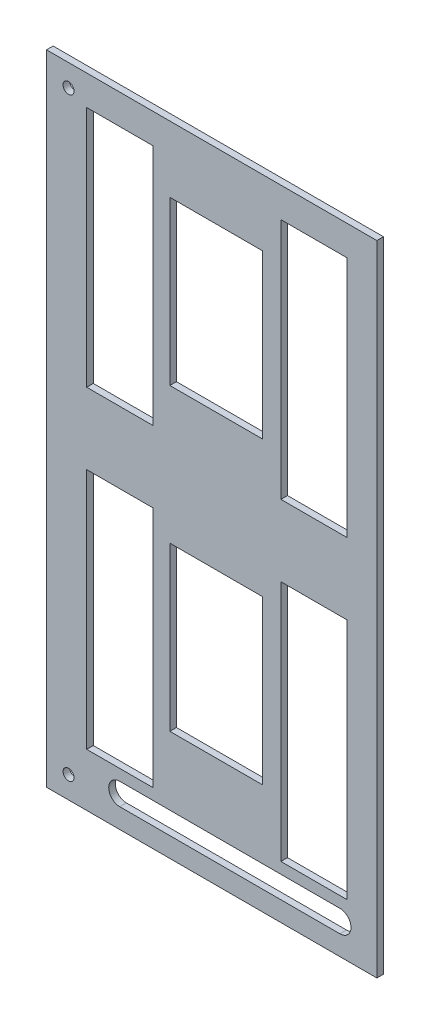
ISO-10303-21;
HEADER;
FILE_DESCRIPTION(('STEP AP214'),'2;1');
FILE_NAME('part.step','',(''),(''),'','','');
FILE_SCHEMA(('AUTOMOTIVE_DESIGN { 1 0 10303 214 1 1 1 1 }'));
ENDSEC;
DATA;
#1=APPLICATION_CONTEXT('core data for automotive mechanical design processes');
#2=APPLICATION_PROTOCOL_DEFINITION('international standard','automotive_design',2000,#1);
#3=PRODUCT_CONTEXT('',#1,'mechanical');
#4=PRODUCT('Part','Part','',(#3));
#5=PRODUCT_RELATED_PRODUCT_CATEGORY('part','',(#4));
#6=PRODUCT_DEFINITION_FORMATION('','',#4);
#7=PRODUCT_DEFINITION_CONTEXT('part definition',#1,'design');
#8=PRODUCT_DEFINITION('design','',#6,#7);
#9=PRODUCT_DEFINITION_SHAPE('','',#8);
#10=(LENGTH_UNIT() NAMED_UNIT(*) SI_UNIT(.MILLI.,.METRE.));
#11=(NAMED_UNIT(*) PLANE_ANGLE_UNIT() SI_UNIT($,.RADIAN.));
#12=(NAMED_UNIT(*) SI_UNIT($,.STERADIAN.) SOLID_ANGLE_UNIT());
#13=UNCERTAINTY_MEASURE_WITH_UNIT(LENGTH_MEASURE(1.E-05),#10,'distance_accuracy_value','');
#14=(GEOMETRIC_REPRESENTATION_CONTEXT(3) GLOBAL_UNCERTAINTY_ASSIGNED_CONTEXT((#13)) GLOBAL_UNIT_ASSIGNED_CONTEXT((#10,
#11,#12)) REPRESENTATION_CONTEXT('',''));
#15=CARTESIAN_POINT('',(0.,0.,0.));
#16=DIRECTION('',(0.,0.,1.));
#17=DIRECTION('',(1.,0.,0.));
#18=AXIS2_PLACEMENT_3D('',#15,#16,#17);
#19=CARTESIAN_POINT('',(-28.174258775512,51.6961515646284,3.));
#20=DIRECTION('',(1.,0.,0.));
#21=DIRECTION('',(0.,1.,0.));
#22=AXIS2_PLACEMENT_3D('',#19,#20,#21);
#23=PLANE('',#22);
#24=DIRECTION('',(0.,-1.,0.));
#25=VECTOR('',#24,1.);
#26=CARTESIAN_POINT('',(-28.174258775512,51.6961515646284,0.));
#27=LINE('',#26,#25);
#28=CARTESIAN_POINT('',(-28.174258775512,51.6961515646284,0.));
#29=VERTEX_POINT('',#28);
#30=CARTESIAN_POINT('',(-28.1742587755119,-238.303848435372,0.));
#31=VERTEX_POINT('',#30);
#32=EDGE_CURVE('E452',#29,#31,#27,.T.);
#33=ORIENTED_EDGE('',*,*,#32,.T.);
#34=DIRECTION('',(0.,0.,-1.));
#35=VECTOR('',#34,1.);
#36=CARTESIAN_POINT('',(-28.1742587755119,-238.303848435372,3.));
#37=LINE('',#36,#35);
#38=CARTESIAN_POINT('',(-28.1742587755119,-238.303848435372,3.));
#39=VERTEX_POINT('',#38);
#40=EDGE_CURVE('E11',#39,#31,#37,.T.);
#41=ORIENTED_EDGE('',*,*,#40,.F.);
#42=DIRECTION('',(0.,-1.,0.));
#43=VECTOR('',#42,1.);
#44=CARTESIAN_POINT('',(-28.174258775512,51.6961515646284,3.));
#45=LINE('',#44,#43);
#46=CARTESIAN_POINT('',(-28.174258775512,51.6961515646284,3.));
#47=VERTEX_POINT('',#46);
#48=EDGE_CURVE('E488',#47,#39,#45,.T.);
#49=ORIENTED_EDGE('',*,*,#48,.F.);
#50=DIRECTION('',(0.,0.,-1.));
#51=VECTOR('',#50,1.);
#52=CARTESIAN_POINT('',(-28.174258775512,51.6961515646284,3.));
#53=LINE('',#52,#51);
#54=EDGE_CURVE('E498',#47,#29,#53,.T.);
#55=ORIENTED_EDGE('',*,*,#54,.T.);
#56=EDGE_LOOP('',(#33,#41,#49,#55));
#57=FACE_BOUND('',#56,.T.);
#58=ADVANCED_FACE('F41',(#57),#23,.F.);
#59=CARTESIAN_POINT('',(-28.1742587755119,-238.303848435372,3.));
#60=DIRECTION('',(0.,1.,0.));
#61=DIRECTION('',(0.,0.,1.));
#62=AXIS2_PLACEMENT_3D('',#59,#60,#61);
#63=PLANE('',#62);
#64=DIRECTION('',(1.,0.,0.));
#65=VECTOR('',#64,1.);
#66=CARTESIAN_POINT('',(-28.1742587755119,-238.303848435372,0.));
#67=LINE('',#66,#65);
#68=CARTESIAN_POINT('',(121.825741224488,-238.303848435372,0.));
#69=VERTEX_POINT('',#68);
#70=EDGE_CURVE('E501',#31,#69,#67,.T.);
#71=ORIENTED_EDGE('',*,*,#70,.T.);
#72=DIRECTION('',(0.,0.,-1.));
#73=VECTOR('',#72,1.);
#74=CARTESIAN_POINT('',(121.825741224488,-238.303848435372,3.));
#75=LINE('',#74,#73);
#76=CARTESIAN_POINT('',(121.825741224488,-238.303848435372,3.));
#77=VERTEX_POINT('',#76);
#78=EDGE_CURVE('E48',#77,#69,#75,.T.);
#79=ORIENTED_EDGE('',*,*,#78,.F.);
#80=DIRECTION('',(1.,0.,0.));
#81=VECTOR('',#80,1.);
#82=CARTESIAN_POINT('',(-28.1742587755119,-238.303848435372,3.));
#83=LINE('',#82,#81);
#84=EDGE_CURVE('E491',#39,#77,#83,.T.);
#85=ORIENTED_EDGE('',*,*,#84,.F.);
#86=ORIENTED_EDGE('',*,*,#40,.T.);
#87=EDGE_LOOP('',(#71,#79,#85,#86));
#88=FACE_BOUND('',#87,.T.);
#89=ADVANCED_FACE('F530',(#88),#63,.F.);
#90=CARTESIAN_POINT('',(121.825741224488,51.6961515646284,3.));
#91=DIRECTION('',(-1.,0.,0.));
#92=DIRECTION('',(0.,-1.,0.));
#93=AXIS2_PLACEMENT_3D('',#90,#91,#92);
#94=PLANE('',#93);
#95=DIRECTION('',(0.,1.,0.));
#96=VECTOR('',#95,1.);
#97=CARTESIAN_POINT('',(121.825741224488,51.6961515646284,0.));
#98=LINE('',#97,#96);
#99=CARTESIAN_POINT('',(121.825741224488,51.6961515646284,0.));
#100=VERTEX_POINT('',#99);
#101=EDGE_CURVE('E503',#69,#100,#98,.T.);
#102=ORIENTED_EDGE('',*,*,#101,.T.);
#103=DIRECTION('',(0.,0.,-1.));
#104=VECTOR('',#103,1.);
#105=CARTESIAN_POINT('',(121.825741224488,51.6961515646284,3.));
#106=LINE('',#105,#104);
#107=CARTESIAN_POINT('',(121.825741224488,51.6961515646284,3.));
#108=VERTEX_POINT('',#107);
#109=EDGE_CURVE('E508',#108,#100,#106,.T.);
#110=ORIENTED_EDGE('',*,*,#109,.F.);
#111=DIRECTION('',(0.,1.,0.));
#112=VECTOR('',#111,1.);
#113=CARTESIAN_POINT('',(121.825741224488,51.6961515646284,3.));
#114=LINE('',#113,#112);
#115=EDGE_CURVE('E494',#77,#108,#114,.T.);
#116=ORIENTED_EDGE('',*,*,#115,.F.);
#117=ORIENTED_EDGE('',*,*,#78,.T.);
#118=EDGE_LOOP('',(#102,#110,#116,#117));
#119=FACE_BOUND('',#118,.T.);
#120=ADVANCED_FACE('F515',(#119),#94,.F.);
#121=CARTESIAN_POINT('',(-28.174258775512,51.6961515646284,3.));
#122=DIRECTION('',(0.,-1.,0.));
#123=DIRECTION('',(0.,0.,-1.));
#124=AXIS2_PLACEMENT_3D('',#121,#122,#123);
#125=PLANE('',#124);
#126=DIRECTION('',(-1.,0.,0.));
#127=VECTOR('',#126,1.);
#128=CARTESIAN_POINT('',(-28.174258775512,51.6961515646284,0.));
#129=LINE('',#128,#127);
#130=EDGE_CURVE('E492',#100,#29,#129,.T.);
#131=ORIENTED_EDGE('',*,*,#130,.T.);
#132=ORIENTED_EDGE('',*,*,#54,.F.);
#133=DIRECTION('',(-1.,0.,0.));
#134=VECTOR('',#133,1.);
#135=CARTESIAN_POINT('',(-28.174258775512,51.6961515646284,3.));
#136=LINE('',#135,#134);
#137=EDGE_CURVE('E496',#108,#47,#136,.T.);
#138=ORIENTED_EDGE('',*,*,#137,.F.);
#139=ORIENTED_EDGE('',*,*,#109,.T.);
#140=EDGE_LOOP('',(#131,#132,#138,#139));
#141=FACE_BOUND('',#140,.T.);
#142=ADVANCED_FACE('F523',(#141),#125,.F.);
#143=CARTESIAN_POINT('',(0.,0.,3.));
#144=DIRECTION('',(0.,0.,1.));
#145=DIRECTION('',(1.,0.,0.));
#146=AXIS2_PLACEMENT_3D('',#143,#144,#145);
#147=PLANE('',#146);
#148=CARTESIAN_POINT('',(5.06832233341044,-224.315553818243,3.));
#149=DIRECTION('',(0.,0.,1.));
#150=DIRECTION('',(1.,0.,0.));
#151=AXIS2_PLACEMENT_3D('',#148,#149,#150);
#152=CIRCLE('',#151,5.);
#153=CARTESIAN_POINT('',(5.06832233341044,-219.315553818243,3.));
#154=VERTEX_POINT('',#153);
#155=CARTESIAN_POINT('',(5.06832233341044,-229.315553818243,3.));
#156=VERTEX_POINT('',#155);
#157=EDGE_CURVE('E55',#154,#156,#152,.T.);
#158=ORIENTED_EDGE('',*,*,#157,.F.);
#159=DIRECTION('',(-1.,0.,0.));
#160=VECTOR('',#159,1.);
#161=CARTESIAN_POINT('',(5.06832233341044,-219.315553818243,3.));
#162=LINE('',#161,#160);
#163=CARTESIAN_POINT('',(105.06832233341,-219.315553818243,3.));
#164=VERTEX_POINT('',#163);
#165=EDGE_CURVE('E267',#164,#154,#162,.T.);
#166=ORIENTED_EDGE('',*,*,#165,.F.);
#167=CARTESIAN_POINT('',(105.06832233341,-224.315553818243,3.));
#168=DIRECTION('',(0.,0.,1.));
#169=DIRECTION('',(1.,0.,0.));
#170=AXIS2_PLACEMENT_3D('',#167,#168,#169);
#171=CIRCLE('',#170,5.);
#172=CARTESIAN_POINT('',(105.06832233341,-229.315553818243,3.));
#173=VERTEX_POINT('',#172);
#174=EDGE_CURVE('E270',#173,#164,#171,.T.);
#175=ORIENTED_EDGE('',*,*,#174,.F.);
#176=DIRECTION('',(1.,0.,0.));
#177=VECTOR('',#176,1.);
#178=CARTESIAN_POINT('',(5.06832233341044,-229.315553818243,3.));
#179=LINE('',#178,#177);
#180=EDGE_CURVE('E276',#156,#173,#179,.T.);
#181=ORIENTED_EDGE('',*,*,#180,.F.);
#182=EDGE_LOOP('',(#158,#166,#175,#181));
#183=FACE_BOUND('',#182,.T.);
#184=DIRECTION('',(0.,-1.,0.));
#185=VECTOR('',#184,1.);
#186=CARTESIAN_POINT('',(78.2461882714922,-104.262913685084,3.));
#187=LINE('',#186,#185);
#188=CARTESIAN_POINT('',(78.2461882714922,-104.262913685084,3.));
#189=VERTEX_POINT('',#188);
#190=CARTESIAN_POINT('',(78.2461882714922,-214.262913685084,3.));
#191=VERTEX_POINT('',#190);
#192=EDGE_CURVE('E330',#189,#191,#187,.T.);
#193=ORIENTED_EDGE('',*,*,#192,.F.);
#194=DIRECTION('',(-1.,0.,0.));
#195=VECTOR('',#194,1.);
#196=CARTESIAN_POINT('',(78.2461882714922,-104.262913685084,3.));
#197=LINE('',#196,#195);
#198=CARTESIAN_POINT('',(108.246188271492,-104.262913685084,3.));
#199=VERTEX_POINT('',#198);
#200=EDGE_CURVE('E361',#199,#189,#197,.T.);
#201=ORIENTED_EDGE('',*,*,#200,.F.);
#202=DIRECTION('',(0.,1.,0.));
#203=VECTOR('',#202,1.);
#204=CARTESIAN_POINT('',(108.246188271492,-104.262913685084,3.));
#205=LINE('',#204,#203);
#206=CARTESIAN_POINT('',(108.246188271492,-214.262913685084,3.));
#207=VERTEX_POINT('',#206);
#208=EDGE_CURVE('E364',#207,#199,#205,.T.);
#209=ORIENTED_EDGE('',*,*,#208,.F.);
#210=DIRECTION('',(1.,0.,0.));
#211=VECTOR('',#210,1.);
#212=CARTESIAN_POINT('',(78.2461882714922,-214.262913685084,3.));
#213=LINE('',#212,#211);
#214=EDGE_CURVE('E368',#191,#207,#213,.T.);
#215=ORIENTED_EDGE('',*,*,#214,.F.);
#216=EDGE_LOOP('',(#193,#201,#209,#215));
#217=FACE_BOUND('',#216,.T.);
#218=DIRECTION('',(0.,-1.,0.));
#219=VECTOR('',#218,1.);
#220=CARTESIAN_POINT('',(-9.93167766658958,-104.262913685084,3.));
#221=LINE('',#220,#219);
#222=CARTESIAN_POINT('',(-9.93167766658958,-104.262913685084,3.));
#223=VERTEX_POINT('',#222);
#224=CARTESIAN_POINT('',(-9.93167766658956,-214.262913685084,3.));
#225=VERTEX_POINT('',#224);
#226=EDGE_CURVE('E296',#223,#225,#221,.T.);
#227=ORIENTED_EDGE('',*,*,#226,.F.);
#228=DIRECTION('',(-1.,0.,0.));
#229=VECTOR('',#228,1.);
#230=CARTESIAN_POINT('',(-9.93167766658958,-104.262913685084,3.));
#231=LINE('',#230,#229);
#232=CARTESIAN_POINT('',(20.0683223334104,-104.262913685084,3.));
#233=VERTEX_POINT('',#232);
#234=EDGE_CURVE('E331',#233,#223,#231,.T.);
#235=ORIENTED_EDGE('',*,*,#234,.F.);
#236=DIRECTION('',(0.,1.,0.));
#237=VECTOR('',#236,1.);
#238=CARTESIAN_POINT('',(20.0683223334104,-104.262913685084,3.));
#239=LINE('',#238,#237);
#240=CARTESIAN_POINT('',(20.0683223334104,-214.262913685084,3.));
#241=VERTEX_POINT('',#240);
#242=EDGE_CURVE('E334',#241,#233,#239,.T.);
#243=ORIENTED_EDGE('',*,*,#242,.F.);
#244=DIRECTION('',(1.,0.,0.));
#245=VECTOR('',#244,1.);
#246=CARTESIAN_POINT('',(-9.93167766658956,-214.262913685084,3.));
#247=LINE('',#246,#245);
#248=EDGE_CURVE('E338',#225,#241,#247,.T.);
#249=ORIENTED_EDGE('',*,*,#248,.F.);
#250=EDGE_LOOP('',(#227,#235,#243,#249));
#251=FACE_BOUND('',#250,.T.);
#252=DIRECTION('',(0.,-1.,0.));
#253=VECTOR('',#252,1.);
#254=CARTESIAN_POINT('',(-9.93167766658959,38.1274839511129,3.));
#255=LINE('',#254,#253);
#256=CARTESIAN_POINT('',(-9.93167766658959,38.1274839511129,3.));
#257=VERTEX_POINT('',#256);
#258=CARTESIAN_POINT('',(-9.93167766658958,-71.8725160488871,3.));
#259=VERTEX_POINT('',#258);
#260=EDGE_CURVE('E307',#257,#259,#255,.T.);
#261=ORIENTED_EDGE('',*,*,#260,.F.);
#262=DIRECTION('',(-1.,0.,0.));
#263=VECTOR('',#262,1.);
#264=CARTESIAN_POINT('',(-9.93167766658959,38.1274839511129,3.));
#265=LINE('',#264,#263);
#266=CARTESIAN_POINT('',(20.0683223334104,38.1274839511129,3.));
#267=VERTEX_POINT('',#266);
#268=EDGE_CURVE('E297',#267,#257,#265,.T.);
#269=ORIENTED_EDGE('',*,*,#268,.F.);
#270=DIRECTION('',(0.,1.,0.));
#271=VECTOR('',#270,1.);
#272=CARTESIAN_POINT('',(20.0683223334104,38.1274839511129,3.));
#273=LINE('',#272,#271);
#274=CARTESIAN_POINT('',(20.0683223334104,-71.8725160488871,3.));
#275=VERTEX_POINT('',#274);
#276=EDGE_CURVE('E300',#275,#267,#273,.T.);
#277=ORIENTED_EDGE('',*,*,#276,.F.);
#278=DIRECTION('',(1.,0.,0.));
#279=VECTOR('',#278,1.);
#280=CARTESIAN_POINT('',(-9.93167766658958,-71.8725160488871,3.));
#281=LINE('',#280,#279);
#282=EDGE_CURVE('E304',#259,#275,#281,.T.);
#283=ORIENTED_EDGE('',*,*,#282,.F.);
#284=EDGE_LOOP('',(#261,#269,#277,#283));
#285=FACE_BOUND('',#284,.T.);
#286=DIRECTION('',(0.,-1.,0.));
#287=VECTOR('',#286,1.);
#288=CARTESIAN_POINT('',(78.2461882714922,38.1274839511129,3.));
#289=LINE('',#288,#287);
#290=CARTESIAN_POINT('',(78.2461882714922,38.1274839511129,3.));
#291=VERTEX_POINT('',#290);
#292=CARTESIAN_POINT('',(78.2461882714922,-71.8725160488871,3.));
#293=VERTEX_POINT('',#292);
#294=EDGE_CURVE('E309',#291,#293,#289,.T.);
#295=ORIENTED_EDGE('',*,*,#294,.F.);
#296=DIRECTION('',(-1.,0.,0.));
#297=VECTOR('',#296,1.);
#298=CARTESIAN_POINT('',(78.2461882714922,38.1274839511129,3.));
#299=LINE('',#298,#297);
#300=CARTESIAN_POINT('',(108.246188271492,38.1274839511129,3.));
#301=VERTEX_POINT('',#300);
#302=EDGE_CURVE('E386',#301,#291,#299,.T.);
#303=ORIENTED_EDGE('',*,*,#302,.F.);
#304=DIRECTION('',(0.,1.,0.));
#305=VECTOR('',#304,1.);
#306=CARTESIAN_POINT('',(108.246188271492,38.1274839511129,3.));
#307=LINE('',#306,#305);
#308=CARTESIAN_POINT('',(108.246188271492,-71.8725160488871,3.));
#309=VERTEX_POINT('',#308);
#310=EDGE_CURVE('E400',#309,#301,#307,.T.);
#311=ORIENTED_EDGE('',*,*,#310,.F.);
#312=DIRECTION('',(1.,0.,0.));
#313=VECTOR('',#312,1.);
#314=CARTESIAN_POINT('',(78.2461882714922,-71.8725160488871,3.));
#315=LINE('',#314,#313);
#316=EDGE_CURVE('E397',#293,#309,#315,.T.);
#317=ORIENTED_EDGE('',*,*,#316,.F.);
#318=EDGE_LOOP('',(#295,#303,#311,#317));
#319=FACE_BOUND('',#318,.T.);
#320=CARTESIAN_POINT('',(-18.174258775512,41.6961515646284,3.));
#321=DIRECTION('',(0.,0.,1.));
#322=DIRECTION('',(1.,0.,0.));
#323=AXIS2_PLACEMENT_3D('',#320,#321,#322);
#324=CIRCLE('',#323,2.5);
#325=CARTESIAN_POINT('',(-15.674258775512,41.6961515646284,3.));
#326=VERTEX_POINT('',#325);
#327=EDGE_CURVE('E418',#326,#326,#324,.T.);
#328=ORIENTED_EDGE('',*,*,#327,.F.);
#329=EDGE_LOOP('',(#328));
#330=FACE_BOUND('',#329,.T.);
#331=CARTESIAN_POINT('',(-18.174258775512,-228.303848435372,3.));
#332=DIRECTION('',(0.,0.,1.));
#333=DIRECTION('',(1.,0.,0.));
#334=AXIS2_PLACEMENT_3D('',#331,#332,#333);
#335=CIRCLE('',#334,2.5);
#336=CARTESIAN_POINT('',(-15.674258775512,-228.303848435372,3.));
#337=VERTEX_POINT('',#336);
#338=EDGE_CURVE('E421',#337,#337,#335,.T.);
#339=ORIENTED_EDGE('',*,*,#338,.F.);
#340=EDGE_LOOP('',(#339));
#341=FACE_BOUND('',#340,.T.);
#342=DIRECTION('',(0.,-1.,0.));
#343=VECTOR('',#342,1.);
#344=CARTESIAN_POINT('',(27.825741224488,21.6961515646284,3.));
#345=LINE('',#344,#343);
#346=CARTESIAN_POINT('',(27.825741224488,21.6961515646284,3.));
#347=VERTEX_POINT('',#346);
#348=CARTESIAN_POINT('',(27.825741224488,-52.3038484353716,3.));
#349=VERTEX_POINT('',#348);
#350=EDGE_CURVE('E439',#347,#349,#345,.T.);
#351=ORIENTED_EDGE('',*,*,#350,.F.);
#352=DIRECTION('',(1.,0.,0.));
#353=VECTOR('',#352,1.);
#354=CARTESIAN_POINT('',(27.825741224488,21.6961515646284,3.));
#355=LINE('',#354,#353);
#356=CARTESIAN_POINT('',(69.8257412244881,21.6961515646284,3.));
#357=VERTEX_POINT('',#356);
#358=EDGE_CURVE('E430',#347,#357,#355,.T.);
#359=ORIENTED_EDGE('',*,*,#358,.T.);
#360=DIRECTION('',(0.,-1.,0.));
#361=VECTOR('',#360,1.);
#362=CARTESIAN_POINT('',(69.8257412244881,21.6961515646284,3.));
#363=LINE('',#362,#361);
#364=CARTESIAN_POINT('',(69.8257412244881,-52.3038484353716,3.));
#365=VERTEX_POINT('',#364);
#366=EDGE_CURVE('E445',#357,#365,#363,.T.);
#367=ORIENTED_EDGE('',*,*,#366,.T.);
#368=DIRECTION('',(1.,0.,0.));
#369=VECTOR('',#368,1.);
#370=CARTESIAN_POINT('',(27.825741224488,-52.3038484353716,3.));
#371=LINE('',#370,#369);
#372=EDGE_CURVE('E441',#349,#365,#371,.T.);
#373=ORIENTED_EDGE('',*,*,#372,.F.);
#374=EDGE_LOOP('',(#351,#359,#367,#373));
#375=FACE_BOUND('',#374,.T.);
#376=DIRECTION('',(1.,0.,0.));
#377=VECTOR('',#376,1.);
#378=CARTESIAN_POINT('',(27.825741224488,-188.303848435372,3.));
#379=LINE('',#378,#377);
#380=CARTESIAN_POINT('',(27.825741224488,-188.303848435372,3.));
#381=VERTEX_POINT('',#380);
#382=CARTESIAN_POINT('',(69.8257412244881,-188.303848435372,3.));
#383=VERTEX_POINT('',#382);
#384=EDGE_CURVE('E442',#381,#383,#379,.T.);
#385=ORIENTED_EDGE('',*,*,#384,.F.);
#386=DIRECTION('',(0.,-1.,0.));
#387=VECTOR('',#386,1.);
#388=CARTESIAN_POINT('',(27.825741224488,-114.303848435372,3.));
#389=LINE('',#388,#387);
#390=CARTESIAN_POINT('',(27.825741224488,-114.303848435372,3.));
#391=VERTEX_POINT('',#390);
#392=EDGE_CURVE('E468',#391,#381,#389,.T.);
#393=ORIENTED_EDGE('',*,*,#392,.F.);
#394=DIRECTION('',(1.,0.,0.));
#395=VECTOR('',#394,1.);
#396=CARTESIAN_POINT('',(27.825741224488,-114.303848435372,3.));
#397=LINE('',#396,#395);
#398=CARTESIAN_POINT('',(69.825741224488,-114.303848435372,3.));
#399=VERTEX_POINT('',#398);
#400=EDGE_CURVE('E471',#391,#399,#397,.T.);
#401=ORIENTED_EDGE('',*,*,#400,.T.);
#402=DIRECTION('',(0.,-1.,0.));
#403=VECTOR('',#402,1.);
#404=CARTESIAN_POINT('',(69.825741224488,-114.303848435372,3.));
#405=LINE('',#404,#403);
#406=EDGE_CURVE('E475',#399,#383,#405,.T.);
#407=ORIENTED_EDGE('',*,*,#406,.T.);
#408=EDGE_LOOP('',(#385,#393,#401,#407));
#409=FACE_BOUND('',#408,.T.);
#410=ORIENTED_EDGE('',*,*,#48,.T.);
#411=ORIENTED_EDGE('',*,*,#84,.T.);
#412=ORIENTED_EDGE('',*,*,#115,.T.);
#413=ORIENTED_EDGE('',*,*,#137,.T.);
#414=EDGE_LOOP('',(#410,#411,#412,#413));
#415=FACE_BOUND('',#414,.T.);
#416=ADVANCED_FACE('F529',(#183,#217,#251,#285,#319,#330,#341,#375,#409,#415),#147,.T.);
#417=CARTESIAN_POINT('',(0.,0.,0.));
#418=DIRECTION('',(0.,0.,1.));
#419=DIRECTION('',(1.,0.,0.));
#420=AXIS2_PLACEMENT_3D('',#417,#418,#419);
#421=PLANE('',#420);
#422=DIRECTION('',(-1.,0.,0.));
#423=VECTOR('',#422,1.);
#424=CARTESIAN_POINT('',(5.06832233341044,-219.315553818243,0.));
#425=LINE('',#424,#423);
#426=CARTESIAN_POINT('',(105.06832233341,-219.315553818243,0.));
#427=VERTEX_POINT('',#426);
#428=CARTESIAN_POINT('',(5.06832233341044,-219.315553818243,0.));
#429=VERTEX_POINT('',#428);
#430=EDGE_CURVE('E257',#427,#429,#425,.T.);
#431=ORIENTED_EDGE('',*,*,#430,.T.);
#432=CARTESIAN_POINT('',(5.06832233341044,-224.315553818243,0.));
#433=DIRECTION('',(0.,0.,1.));
#434=DIRECTION('',(1.,0.,0.));
#435=AXIS2_PLACEMENT_3D('',#432,#433,#434);
#436=CIRCLE('',#435,5.);
#437=CARTESIAN_POINT('',(5.06832233341044,-229.315553818243,0.));
#438=VERTEX_POINT('',#437);
#439=EDGE_CURVE('E251',#429,#438,#436,.T.);
#440=ORIENTED_EDGE('',*,*,#439,.T.);
#441=DIRECTION('',(1.,0.,0.));
#442=VECTOR('',#441,1.);
#443=CARTESIAN_POINT('',(5.06832233341044,-229.315553818243,0.));
#444=LINE('',#443,#442);
#445=CARTESIAN_POINT('',(105.06832233341,-229.315553818243,0.));
#446=VERTEX_POINT('',#445);
#447=EDGE_CURVE('E260',#438,#446,#444,.T.);
#448=ORIENTED_EDGE('',*,*,#447,.T.);
#449=CARTESIAN_POINT('',(105.06832233341,-224.315553818243,0.));
#450=DIRECTION('',(0.,0.,1.));
#451=DIRECTION('',(1.,0.,0.));
#452=AXIS2_PLACEMENT_3D('',#449,#450,#451);
#453=CIRCLE('',#452,5.);
#454=EDGE_CURVE('E63',#446,#427,#453,.T.);
#455=ORIENTED_EDGE('',*,*,#454,.T.);
#456=EDGE_LOOP('',(#431,#440,#448,#455));
#457=FACE_BOUND('',#456,.T.);
#458=DIRECTION('',(-1.,0.,0.));
#459=VECTOR('',#458,1.);
#460=CARTESIAN_POINT('',(78.2461882714922,-104.262913685084,0.));
#461=LINE('',#460,#459);
#462=CARTESIAN_POINT('',(108.246188271492,-104.262913685084,0.));
#463=VERTEX_POINT('',#462);
#464=CARTESIAN_POINT('',(78.2461882714922,-104.262913685084,0.));
#465=VERTEX_POINT('',#464);
#466=EDGE_CURVE('E355',#463,#465,#461,.T.);
#467=ORIENTED_EDGE('',*,*,#466,.T.);
#468=DIRECTION('',(0.,-1.,0.));
#469=VECTOR('',#468,1.);
#470=CARTESIAN_POINT('',(78.2461882714922,-104.262913685084,0.));
#471=LINE('',#470,#469);
#472=CARTESIAN_POINT('',(78.2461882714922,-214.262913685084,0.));
#473=VERTEX_POINT('',#472);
#474=EDGE_CURVE('E365',#465,#473,#471,.T.);
#475=ORIENTED_EDGE('',*,*,#474,.T.);
#476=DIRECTION('',(1.,0.,0.));
#477=VECTOR('',#476,1.);
#478=CARTESIAN_POINT('',(78.2461882714922,-214.262913685084,0.));
#479=LINE('',#478,#477);
#480=CARTESIAN_POINT('',(108.246188271492,-214.262913685084,0.));
#481=VERTEX_POINT('',#480);
#482=EDGE_CURVE('E377',#473,#481,#479,.T.);
#483=ORIENTED_EDGE('',*,*,#482,.T.);
#484=DIRECTION('',(0.,1.,0.));
#485=VECTOR('',#484,1.);
#486=CARTESIAN_POINT('',(108.246188271492,-104.262913685084,0.));
#487=LINE('',#486,#485);
#488=EDGE_CURVE('E374',#481,#463,#487,.T.);
#489=ORIENTED_EDGE('',*,*,#488,.T.);
#490=EDGE_LOOP('',(#467,#475,#483,#489));
#491=FACE_BOUND('',#490,.T.);
#492=DIRECTION('',(-1.,0.,0.));
#493=VECTOR('',#492,1.);
#494=CARTESIAN_POINT('',(-9.93167766658958,-104.262913685084,0.));
#495=LINE('',#494,#493);
#496=CARTESIAN_POINT('',(20.0683223334104,-104.262913685084,0.));
#497=VERTEX_POINT('',#496);
#498=CARTESIAN_POINT('',(-9.93167766658958,-104.262913685084,0.));
#499=VERTEX_POINT('',#498);
#500=EDGE_CURVE('E323',#497,#499,#495,.T.);
#501=ORIENTED_EDGE('',*,*,#500,.T.);
#502=DIRECTION('',(0.,-1.,0.));
#503=VECTOR('',#502,1.);
#504=CARTESIAN_POINT('',(-9.93167766658958,-104.262913685084,0.));
#505=LINE('',#504,#503);
#506=CARTESIAN_POINT('',(-9.93167766658956,-214.262913685084,0.));
#507=VERTEX_POINT('',#506);
#508=EDGE_CURVE('E335',#499,#507,#505,.T.);
#509=ORIENTED_EDGE('',*,*,#508,.T.);
#510=DIRECTION('',(1.,0.,0.));
#511=VECTOR('',#510,1.);
#512=CARTESIAN_POINT('',(-9.93167766658956,-214.262913685084,0.));
#513=LINE('',#512,#511);
#514=CARTESIAN_POINT('',(20.0683223334104,-214.262913685084,0.));
#515=VERTEX_POINT('',#514);
#516=EDGE_CURVE('E347',#507,#515,#513,.T.);
#517=ORIENTED_EDGE('',*,*,#516,.T.);
#518=DIRECTION('',(0.,1.,0.));
#519=VECTOR('',#518,1.);
#520=CARTESIAN_POINT('',(20.0683223334104,-104.262913685084,0.));
#521=LINE('',#520,#519);
#522=EDGE_CURVE('E344',#515,#497,#521,.T.);
#523=ORIENTED_EDGE('',*,*,#522,.T.);
#524=EDGE_LOOP('',(#501,#509,#517,#523));
#525=FACE_BOUND('',#524,.T.);
#526=DIRECTION('',(-1.,0.,0.));
#527=VECTOR('',#526,1.);
#528=CARTESIAN_POINT('',(-9.93167766658959,38.1274839511129,0.));
#529=LINE('',#528,#527);
#530=CARTESIAN_POINT('',(20.0683223334104,38.1274839511129,0.));
#531=VERTEX_POINT('',#530);
#532=CARTESIAN_POINT('',(-9.93167766658959,38.1274839511129,0.));
#533=VERTEX_POINT('',#532);
#534=EDGE_CURVE('E289',#531,#533,#529,.T.);
#535=ORIENTED_EDGE('',*,*,#534,.T.);
#536=DIRECTION('',(0.,-1.,0.));
#537=VECTOR('',#536,1.);
#538=CARTESIAN_POINT('',(-9.93167766658959,38.1274839511129,0.));
#539=LINE('',#538,#537);
#540=CARTESIAN_POINT('',(-9.93167766658958,-71.8725160488871,0.));
#541=VERTEX_POINT('',#540);
#542=EDGE_CURVE('E301',#533,#541,#539,.T.);
#543=ORIENTED_EDGE('',*,*,#542,.T.);
#544=DIRECTION('',(1.,0.,0.));
#545=VECTOR('',#544,1.);
#546=CARTESIAN_POINT('',(-9.93167766658958,-71.8725160488871,0.));
#547=LINE('',#546,#545);
#548=CARTESIAN_POINT('',(20.0683223334104,-71.8725160488871,0.));
#549=VERTEX_POINT('',#548);
#550=EDGE_CURVE('E315',#541,#549,#547,.T.);
#551=ORIENTED_EDGE('',*,*,#550,.T.);
#552=DIRECTION('',(0.,1.,0.));
#553=VECTOR('',#552,1.);
#554=CARTESIAN_POINT('',(20.0683223334104,38.1274839511129,0.));
#555=LINE('',#554,#553);
#556=EDGE_CURVE('E312',#549,#531,#555,.T.);
#557=ORIENTED_EDGE('',*,*,#556,.T.);
#558=EDGE_LOOP('',(#535,#543,#551,#557));
#559=FACE_BOUND('',#558,.T.);
#560=DIRECTION('',(-1.,0.,0.));
#561=VECTOR('',#560,1.);
#562=CARTESIAN_POINT('',(78.2461882714922,38.1274839511129,0.));
#563=LINE('',#562,#561);
#564=CARTESIAN_POINT('',(108.246188271492,38.1274839511129,0.));
#565=VERTEX_POINT('',#564);
#566=CARTESIAN_POINT('',(78.2461882714922,38.1274839511129,0.));
#567=VERTEX_POINT('',#566);
#568=EDGE_CURVE('E392',#565,#567,#563,.T.);
#569=ORIENTED_EDGE('',*,*,#568,.T.);
#570=DIRECTION('',(0.,-1.,0.));
#571=VECTOR('',#570,1.);
#572=CARTESIAN_POINT('',(78.2461882714922,38.1274839511129,0.));
#573=LINE('',#572,#571);
#574=CARTESIAN_POINT('',(78.2461882714922,-71.8725160488871,0.));
#575=VERTEX_POINT('',#574);
#576=EDGE_CURVE('E382',#567,#575,#573,.T.);
#577=ORIENTED_EDGE('',*,*,#576,.T.);
#578=DIRECTION('',(1.,0.,0.));
#579=VECTOR('',#578,1.);
#580=CARTESIAN_POINT('',(78.2461882714922,-71.8725160488871,0.));
#581=LINE('',#580,#579);
#582=CARTESIAN_POINT('',(108.246188271492,-71.8725160488871,0.));
#583=VERTEX_POINT('',#582);
#584=EDGE_CURVE('E385',#575,#583,#581,.T.);
#585=ORIENTED_EDGE('',*,*,#584,.T.);
#586=DIRECTION('',(0.,1.,0.));
#587=VECTOR('',#586,1.);
#588=CARTESIAN_POINT('',(108.246188271492,38.1274839511129,0.));
#589=LINE('',#588,#587);
#590=EDGE_CURVE('E389',#583,#565,#589,.T.);
#591=ORIENTED_EDGE('',*,*,#590,.T.);
#592=EDGE_LOOP('',(#569,#577,#585,#591));
#593=FACE_BOUND('',#592,.T.);
#594=CARTESIAN_POINT('',(-18.174258775512,41.6961515646284,0.));
#595=DIRECTION('',(0.,0.,1.));
#596=DIRECTION('',(1.,0.,0.));
#597=AXIS2_PLACEMENT_3D('',#594,#595,#596);
#598=CIRCLE('',#597,2.5);
#599=CARTESIAN_POINT('',(-15.674258775512,41.6961515646284,0.));
#600=VERTEX_POINT('',#599);
#601=EDGE_CURVE('E414',#600,#600,#598,.T.);
#602=ORIENTED_EDGE('',*,*,#601,.T.);
#603=EDGE_LOOP('',(#602));
#604=FACE_BOUND('',#603,.T.);
#605=CARTESIAN_POINT('',(-18.174258775512,-228.303848435372,0.));
#606=DIRECTION('',(0.,0.,1.));
#607=DIRECTION('',(1.,0.,0.));
#608=AXIS2_PLACEMENT_3D('',#605,#606,#607);
#609=CIRCLE('',#608,2.5);
#610=CARTESIAN_POINT('',(-15.674258775512,-228.303848435372,0.));
#611=VERTEX_POINT('',#610);
#612=EDGE_CURVE('E407',#611,#611,#609,.T.);
#613=ORIENTED_EDGE('',*,*,#612,.T.);
#614=EDGE_LOOP('',(#613));
#615=FACE_BOUND('',#614,.T.);
#616=DIRECTION('',(1.,0.,0.));
#617=VECTOR('',#616,1.);
#618=CARTESIAN_POINT('',(27.825741224488,21.6961515646284,0.));
#619=LINE('',#618,#617);
#620=CARTESIAN_POINT('',(27.825741224488,21.6961515646284,0.));
#621=VERTEX_POINT('',#620);
#622=CARTESIAN_POINT('',(69.8257412244881,21.6961515646284,0.));
#623=VERTEX_POINT('',#622);
#624=EDGE_CURVE('E436',#621,#623,#619,.T.);
#625=ORIENTED_EDGE('',*,*,#624,.F.);
#626=DIRECTION('',(0.,-1.,0.));
#627=VECTOR('',#626,1.);
#628=CARTESIAN_POINT('',(27.825741224488,21.6961515646284,0.));
#629=LINE('',#628,#627);
#630=CARTESIAN_POINT('',(27.825741224488,-52.3038484353716,0.));
#631=VERTEX_POINT('',#630);
#632=EDGE_CURVE('E426',#621,#631,#629,.T.);
#633=ORIENTED_EDGE('',*,*,#632,.T.);
#634=DIRECTION('',(1.,0.,0.));
#635=VECTOR('',#634,1.);
#636=CARTESIAN_POINT('',(27.825741224488,-52.3038484353716,0.));
#637=LINE('',#636,#635);
#638=CARTESIAN_POINT('',(69.8257412244881,-52.3038484353716,0.));
#639=VERTEX_POINT('',#638);
#640=EDGE_CURVE('E429',#631,#639,#637,.T.);
#641=ORIENTED_EDGE('',*,*,#640,.T.);
#642=DIRECTION('',(0.,-1.,0.));
#643=VECTOR('',#642,1.);
#644=CARTESIAN_POINT('',(69.8257412244881,21.6961515646284,0.));
#645=LINE('',#644,#643);
#646=EDGE_CURVE('E433',#623,#639,#645,.T.);
#647=ORIENTED_EDGE('',*,*,#646,.F.);
#648=EDGE_LOOP('',(#625,#633,#641,#647));
#649=FACE_BOUND('',#648,.T.);
#650=DIRECTION('',(0.,-1.,0.));
#651=VECTOR('',#650,1.);
#652=CARTESIAN_POINT('',(27.825741224488,-114.303848435372,0.));
#653=LINE('',#652,#651);
#654=CARTESIAN_POINT('',(27.825741224488,-114.303848435372,0.));
#655=VERTEX_POINT('',#654);
#656=CARTESIAN_POINT('',(27.825741224488,-188.303848435372,0.));
#657=VERTEX_POINT('',#656);
#658=EDGE_CURVE('E462',#655,#657,#653,.T.);
#659=ORIENTED_EDGE('',*,*,#658,.T.);
#660=DIRECTION('',(1.,0.,0.));
#661=VECTOR('',#660,1.);
#662=CARTESIAN_POINT('',(27.825741224488,-188.303848435372,0.));
#663=LINE('',#662,#661);
#664=CARTESIAN_POINT('',(69.8257412244881,-188.303848435372,0.));
#665=VERTEX_POINT('',#664);
#666=EDGE_CURVE('E472',#657,#665,#663,.T.);
#667=ORIENTED_EDGE('',*,*,#666,.T.);
#668=DIRECTION('',(0.,-1.,0.));
#669=VECTOR('',#668,1.);
#670=CARTESIAN_POINT('',(69.825741224488,-114.303848435372,0.));
#671=LINE('',#670,#669);
#672=CARTESIAN_POINT('',(69.825741224488,-114.303848435372,0.));
#673=VERTEX_POINT('',#672);
#674=EDGE_CURVE('E484',#673,#665,#671,.T.);
#675=ORIENTED_EDGE('',*,*,#674,.F.);
#676=DIRECTION('',(1.,0.,0.));
#677=VECTOR('',#676,1.);
#678=CARTESIAN_POINT('',(27.825741224488,-114.303848435372,0.));
#679=LINE('',#678,#677);
#680=EDGE_CURVE('E481',#655,#673,#679,.T.);
#681=ORIENTED_EDGE('',*,*,#680,.F.);
#682=EDGE_LOOP('',(#659,#667,#675,#681));
#683=FACE_BOUND('',#682,.T.);
#684=ORIENTED_EDGE('',*,*,#32,.F.);
#685=ORIENTED_EDGE('',*,*,#130,.F.);
#686=ORIENTED_EDGE('',*,*,#101,.F.);
#687=ORIENTED_EDGE('',*,*,#70,.F.);
#688=EDGE_LOOP('',(#684,#685,#686,#687));
#689=FACE_BOUND('',#688,.T.);
#690=ADVANCED_FACE('F264',(#457,#491,#525,#559,#593,#604,#615,#649,#683,#689),#421,.F.);
#691=CARTESIAN_POINT('',(27.825741224488,-188.303848435372,0.));
#692=DIRECTION('',(0.,-1.,0.));
#693=DIRECTION('',(0.,0.,-1.));
#694=AXIS2_PLACEMENT_3D('',#691,#692,#693);
#695=PLANE('',#694);
#696=ORIENTED_EDGE('',*,*,#384,.T.);
#697=DIRECTION('',(0.,0.,1.));
#698=VECTOR('',#697,1.);
#699=CARTESIAN_POINT('',(69.8257412244881,-188.303848435372,0.));
#700=LINE('',#699,#698);
#701=EDGE_CURVE('E459',#665,#383,#700,.T.);
#702=ORIENTED_EDGE('',*,*,#701,.F.);
#703=ORIENTED_EDGE('',*,*,#666,.F.);
#704=DIRECTION('',(0.,0.,1.));
#705=VECTOR('',#704,1.);
#706=CARTESIAN_POINT('',(27.825741224488,-188.303848435372,0.));
#707=LINE('',#706,#705);
#708=EDGE_CURVE('E417',#657,#381,#707,.T.);
#709=ORIENTED_EDGE('',*,*,#708,.T.);
#710=EDGE_LOOP('',(#696,#702,#703,#709));
#711=FACE_BOUND('',#710,.T.);
#712=ADVANCED_FACE('F542',(#711),#695,.F.);
#713=CARTESIAN_POINT('',(27.825741224488,-114.303848435372,0.));
#714=DIRECTION('',(-1.,0.,0.));
#715=DIRECTION('',(0.,-1.,0.));
#716=AXIS2_PLACEMENT_3D('',#713,#714,#715);
#717=PLANE('',#716);
#718=ORIENTED_EDGE('',*,*,#392,.T.);
#719=ORIENTED_EDGE('',*,*,#708,.F.);
#720=ORIENTED_EDGE('',*,*,#658,.F.);
#721=DIRECTION('',(0.,0.,1.));
#722=VECTOR('',#721,1.);
#723=CARTESIAN_POINT('',(27.825741224488,-114.303848435372,0.));
#724=LINE('',#723,#722);
#725=EDGE_CURVE('E465',#655,#391,#724,.T.);
#726=ORIENTED_EDGE('',*,*,#725,.T.);
#727=EDGE_LOOP('',(#718,#719,#720,#726));
#728=FACE_BOUND('',#727,.T.);
#729=ADVANCED_FACE('F546',(#728),#717,.F.);
#730=CARTESIAN_POINT('',(27.825741224488,-114.303848435372,0.));
#731=DIRECTION('',(0.,-1.,0.));
#732=DIRECTION('',(1.,0.,0.));
#733=AXIS2_PLACEMENT_3D('',#730,#731,#732);
#734=PLANE('',#733);
#735=ORIENTED_EDGE('',*,*,#400,.F.);
#736=ORIENTED_EDGE('',*,*,#725,.F.);
#737=ORIENTED_EDGE('',*,*,#680,.T.);
#738=DIRECTION('',(0.,0.,1.));
#739=VECTOR('',#738,1.);
#740=CARTESIAN_POINT('',(69.825741224488,-114.303848435372,0.));
#741=LINE('',#740,#739);
#742=EDGE_CURVE('E463',#673,#399,#741,.T.);
#743=ORIENTED_EDGE('',*,*,#742,.T.);
#744=EDGE_LOOP('',(#735,#736,#737,#743));
#745=FACE_BOUND('',#744,.T.);
#746=ADVANCED_FACE('F549',(#745),#734,.T.);
#747=CARTESIAN_POINT('',(69.825741224488,-114.303848435372,0.));
#748=DIRECTION('',(-1.,0.,0.));
#749=DIRECTION('',(0.,-1.,0.));
#750=AXIS2_PLACEMENT_3D('',#747,#748,#749);
#751=PLANE('',#750);
#752=ORIENTED_EDGE('',*,*,#406,.F.);
#753=ORIENTED_EDGE('',*,*,#742,.F.);
#754=ORIENTED_EDGE('',*,*,#674,.T.);
#755=ORIENTED_EDGE('',*,*,#701,.T.);
#756=EDGE_LOOP('',(#752,#753,#754,#755));
#757=FACE_BOUND('',#756,.T.);
#758=ADVANCED_FACE('F553',(#757),#751,.T.);
#759=CARTESIAN_POINT('',(27.825741224488,21.6961515646284,0.));
#760=DIRECTION('',(-1.,0.,0.));
#761=DIRECTION('',(0.,-1.,0.));
#762=AXIS2_PLACEMENT_3D('',#759,#760,#761);
#763=PLANE('',#762);
#764=ORIENTED_EDGE('',*,*,#350,.T.);
#765=DIRECTION('',(0.,0.,1.));
#766=VECTOR('',#765,1.);
#767=CARTESIAN_POINT('',(27.825741224488,-52.3038484353716,0.));
#768=LINE('',#767,#766);
#769=EDGE_CURVE('E438',#631,#349,#768,.T.);
#770=ORIENTED_EDGE('',*,*,#769,.F.);
#771=ORIENTED_EDGE('',*,*,#632,.F.);
#772=DIRECTION('',(0.,0.,1.));
#773=VECTOR('',#772,1.);
#774=CARTESIAN_POINT('',(27.825741224488,21.6961515646284,0.));
#775=LINE('',#774,#773);
#776=EDGE_CURVE('E450',#621,#347,#775,.T.);
#777=ORIENTED_EDGE('',*,*,#776,.T.);
#778=EDGE_LOOP('',(#764,#770,#771,#777));
#779=FACE_BOUND('',#778,.T.);
#780=ADVANCED_FACE('F557',(#779),#763,.F.);
#781=CARTESIAN_POINT('',(27.825741224488,21.6961515646284,0.));
#782=DIRECTION('',(0.,-1.,0.));
#783=DIRECTION('',(0.,0.,-1.));
#784=AXIS2_PLACEMENT_3D('',#781,#782,#783);
#785=PLANE('',#784);
#786=ORIENTED_EDGE('',*,*,#358,.F.);
#787=ORIENTED_EDGE('',*,*,#776,.F.);
#788=ORIENTED_EDGE('',*,*,#624,.T.);
#789=DIRECTION('',(0.,0.,1.));
#790=VECTOR('',#789,1.);
#791=CARTESIAN_POINT('',(69.8257412244881,21.6961515646284,0.));
#792=LINE('',#791,#790);
#793=EDGE_CURVE('E453',#623,#357,#792,.T.);
#794=ORIENTED_EDGE('',*,*,#793,.T.);
#795=EDGE_LOOP('',(#786,#787,#788,#794));
#796=FACE_BOUND('',#795,.T.);
#797=ADVANCED_FACE('F564',(#796),#785,.T.);
#798=CARTESIAN_POINT('',(69.8257412244881,21.6961515646284,0.));
#799=DIRECTION('',(-1.,0.,0.));
#800=DIRECTION('',(0.,-1.,0.));
#801=AXIS2_PLACEMENT_3D('',#798,#799,#800);
#802=PLANE('',#801);
#803=ORIENTED_EDGE('',*,*,#366,.F.);
#804=ORIENTED_EDGE('',*,*,#793,.F.);
#805=ORIENTED_EDGE('',*,*,#646,.T.);
#806=DIRECTION('',(0.,0.,1.));
#807=VECTOR('',#806,1.);
#808=CARTESIAN_POINT('',(69.8257412244881,-52.3038484353716,0.));
#809=LINE('',#808,#807);
#810=EDGE_CURVE('E455',#639,#365,#809,.T.);
#811=ORIENTED_EDGE('',*,*,#810,.T.);
#812=EDGE_LOOP('',(#803,#804,#805,#811));
#813=FACE_BOUND('',#812,.T.);
#814=ADVANCED_FACE('F570',(#813),#802,.T.);
#815=CARTESIAN_POINT('',(27.825741224488,-52.3038484353716,0.));
#816=DIRECTION('',(0.,-1.,0.));
#817=DIRECTION('',(0.,0.,-1.));
#818=AXIS2_PLACEMENT_3D('',#815,#816,#817);
#819=PLANE('',#818);
#820=ORIENTED_EDGE('',*,*,#372,.T.);
#821=ORIENTED_EDGE('',*,*,#810,.F.);
#822=ORIENTED_EDGE('',*,*,#640,.F.);
#823=ORIENTED_EDGE('',*,*,#769,.T.);
#824=EDGE_LOOP('',(#820,#821,#822,#823));
#825=FACE_BOUND('',#824,.T.);
#826=ADVANCED_FACE('F566',(#825),#819,.F.);
#827=CARTESIAN_POINT('',(-18.174258775512,-228.303848435372,0.));
#828=DIRECTION('',(0.,0.,1.));
#829=DIRECTION('',(1.,0.,0.));
#830=AXIS2_PLACEMENT_3D('',#827,#828,#829);
#831=CYLINDRICAL_SURFACE('',#830,2.5);
#832=ORIENTED_EDGE('',*,*,#612,.F.);
#833=EDGE_LOOP('',(#832));
#834=FACE_BOUND('',#833,.T.);
#835=ORIENTED_EDGE('',*,*,#338,.T.);
#836=EDGE_LOOP('',(#835));
#837=FACE_BOUND('',#836,.T.);
#838=ADVANCED_FACE('F569',(#834,#837),#831,.F.);
#839=CARTESIAN_POINT('',(-18.174258775512,41.6961515646284,0.));
#840=DIRECTION('',(0.,0.,1.));
#841=DIRECTION('',(1.,0.,0.));
#842=AXIS2_PLACEMENT_3D('',#839,#840,#841);
#843=CYLINDRICAL_SURFACE('',#842,2.5);
#844=ORIENTED_EDGE('',*,*,#601,.F.);
#845=EDGE_LOOP('',(#844));
#846=FACE_BOUND('',#845,.T.);
#847=ORIENTED_EDGE('',*,*,#327,.T.);
#848=EDGE_LOOP('',(#847));
#849=FACE_BOUND('',#848,.T.);
#850=ADVANCED_FACE('F580',(#846,#849),#843,.F.);
#851=CARTESIAN_POINT('',(78.2461882714922,38.1274839511129,0.));
#852=DIRECTION('',(-1.,0.,0.));
#853=DIRECTION('',(0.,-1.,0.));
#854=AXIS2_PLACEMENT_3D('',#851,#852,#853);
#855=PLANE('',#854);
#856=ORIENTED_EDGE('',*,*,#294,.T.);
#857=DIRECTION('',(0.,0.,1.));
#858=VECTOR('',#857,1.);
#859=CARTESIAN_POINT('',(78.2461882714922,-71.8725160488871,0.));
#860=LINE('',#859,#858);
#861=EDGE_CURVE('E395',#575,#293,#860,.T.);
#862=ORIENTED_EDGE('',*,*,#861,.F.);
#863=ORIENTED_EDGE('',*,*,#576,.F.);
#864=DIRECTION('',(0.,0.,1.));
#865=VECTOR('',#864,1.);
#866=CARTESIAN_POINT('',(78.2461882714922,38.1274839511129,0.));
#867=LINE('',#866,#865);
#868=EDGE_CURVE('E405',#567,#291,#867,.T.);
#869=ORIENTED_EDGE('',*,*,#868,.T.);
#870=EDGE_LOOP('',(#856,#862,#863,#869));
#871=FACE_BOUND('',#870,.T.);
#872=ADVANCED_FACE('F584',(#871),#855,.F.);
#873=CARTESIAN_POINT('',(78.2461882714922,38.1274839511129,0.));
#874=DIRECTION('',(0.,1.,0.));
#875=DIRECTION('',(0.,0.,1.));
#876=AXIS2_PLACEMENT_3D('',#873,#874,#875);
#877=PLANE('',#876);
#878=ORIENTED_EDGE('',*,*,#302,.T.);
#879=ORIENTED_EDGE('',*,*,#868,.F.);
#880=ORIENTED_EDGE('',*,*,#568,.F.);
#881=DIRECTION('',(0.,0.,1.));
#882=VECTOR('',#881,1.);
#883=CARTESIAN_POINT('',(108.246188271492,38.1274839511129,0.));
#884=LINE('',#883,#882);
#885=EDGE_CURVE('E408',#565,#301,#884,.T.);
#886=ORIENTED_EDGE('',*,*,#885,.T.);
#887=EDGE_LOOP('',(#878,#879,#880,#886));
#888=FACE_BOUND('',#887,.T.);
#889=ADVANCED_FACE('F588',(#888),#877,.F.);
#890=CARTESIAN_POINT('',(108.246188271492,38.1274839511129,0.));
#891=DIRECTION('',(1.,0.,0.));
#892=DIRECTION('',(0.,0.,-1.));
#893=AXIS2_PLACEMENT_3D('',#890,#891,#892);
#894=PLANE('',#893);
#895=ORIENTED_EDGE('',*,*,#310,.T.);
#896=ORIENTED_EDGE('',*,*,#885,.F.);
#897=ORIENTED_EDGE('',*,*,#590,.F.);
#898=DIRECTION('',(0.,0.,1.));
#899=VECTOR('',#898,1.);
#900=CARTESIAN_POINT('',(108.246188271492,-71.8725160488871,0.));
#901=LINE('',#900,#899);
#902=EDGE_CURVE('E410',#583,#309,#901,.T.);
#903=ORIENTED_EDGE('',*,*,#902,.T.);
#904=EDGE_LOOP('',(#895,#896,#897,#903));
#905=FACE_BOUND('',#904,.T.);
#906=ADVANCED_FACE('F594',(#905),#894,.F.);
#907=CARTESIAN_POINT('',(78.2461882714922,-71.8725160488871,0.));
#908=DIRECTION('',(0.,-1.,0.));
#909=DIRECTION('',(0.,0.,-1.));
#910=AXIS2_PLACEMENT_3D('',#907,#908,#909);
#911=PLANE('',#910);
#912=ORIENTED_EDGE('',*,*,#316,.T.);
#913=ORIENTED_EDGE('',*,*,#902,.F.);
#914=ORIENTED_EDGE('',*,*,#584,.F.);
#915=ORIENTED_EDGE('',*,*,#861,.T.);
#916=EDGE_LOOP('',(#912,#913,#914,#915));
#917=FACE_BOUND('',#916,.T.);
#918=ADVANCED_FACE('F590',(#917),#911,.F.);
#919=CARTESIAN_POINT('',(-9.93167766658959,38.1274839511129,0.));
#920=DIRECTION('',(-1.,0.,0.));
#921=DIRECTION('',(0.,-1.,0.));
#922=AXIS2_PLACEMENT_3D('',#919,#920,#921);
#923=PLANE('',#922);
#924=ORIENTED_EDGE('',*,*,#260,.T.);
#925=DIRECTION('',(0.,0.,1.));
#926=VECTOR('',#925,1.);
#927=CARTESIAN_POINT('',(-9.93167766658958,-71.8725160488871,0.));
#928=LINE('',#927,#926);
#929=EDGE_CURVE('E286',#541,#259,#928,.T.);
#930=ORIENTED_EDGE('',*,*,#929,.F.);
#931=ORIENTED_EDGE('',*,*,#542,.F.);
#932=DIRECTION('',(0.,0.,1.));
#933=VECTOR('',#932,1.);
#934=CARTESIAN_POINT('',(-9.93167766658959,38.1274839511129,0.));
#935=LINE('',#934,#933);
#936=EDGE_CURVE('E294',#533,#257,#935,.T.);
#937=ORIENTED_EDGE('',*,*,#936,.T.);
#938=EDGE_LOOP('',(#924,#930,#931,#937));
#939=FACE_BOUND('',#938,.T.);
#940=ADVANCED_FACE('F593',(#939),#923,.F.);
#941=CARTESIAN_POINT('',(-9.93167766658959,38.1274839511129,0.));
#942=DIRECTION('',(0.,1.,0.));
#943=DIRECTION('',(0.,0.,1.));
#944=AXIS2_PLACEMENT_3D('',#941,#942,#943);
#945=PLANE('',#944);
#946=ORIENTED_EDGE('',*,*,#268,.T.);
#947=ORIENTED_EDGE('',*,*,#936,.F.);
#948=ORIENTED_EDGE('',*,*,#534,.F.);
#949=DIRECTION('',(0.,0.,1.));
#950=VECTOR('',#949,1.);
#951=CARTESIAN_POINT('',(20.0683223334104,38.1274839511129,0.));
#952=LINE('',#951,#950);
#953=EDGE_CURVE('E292',#531,#267,#952,.T.);
#954=ORIENTED_EDGE('',*,*,#953,.T.);
#955=EDGE_LOOP('',(#946,#947,#948,#954));
#956=FACE_BOUND('',#955,.T.);
#957=ADVANCED_FACE('F635',(#956),#945,.F.);
#958=CARTESIAN_POINT('',(20.0683223334104,38.1274839511129,0.));
#959=DIRECTION('',(1.,0.,0.));
#960=DIRECTION('',(0.,1.,0.));
#961=AXIS2_PLACEMENT_3D('',#958,#959,#960);
#962=PLANE('',#961);
#963=ORIENTED_EDGE('',*,*,#276,.T.);
#964=ORIENTED_EDGE('',*,*,#953,.F.);
#965=ORIENTED_EDGE('',*,*,#556,.F.);
#966=DIRECTION('',(0.,0.,1.));
#967=VECTOR('',#966,1.);
#968=CARTESIAN_POINT('',(20.0683223334104,-71.8725160488871,0.));
#969=LINE('',#968,#967);
#970=EDGE_CURVE('E290',#549,#275,#969,.T.);
#971=ORIENTED_EDGE('',*,*,#970,.T.);
#972=EDGE_LOOP('',(#963,#964,#965,#971));
#973=FACE_BOUND('',#972,.T.);
#974=ADVANCED_FACE('F638',(#973),#962,.F.);
#975=CARTESIAN_POINT('',(-9.93167766658958,-71.8725160488871,0.));
#976=DIRECTION('',(0.,-1.,0.));
#977=DIRECTION('',(0.,0.,-1.));
#978=AXIS2_PLACEMENT_3D('',#975,#976,#977);
#979=PLANE('',#978);
#980=ORIENTED_EDGE('',*,*,#282,.T.);
#981=ORIENTED_EDGE('',*,*,#970,.F.);
#982=ORIENTED_EDGE('',*,*,#550,.F.);
#983=ORIENTED_EDGE('',*,*,#929,.T.);
#984=EDGE_LOOP('',(#980,#981,#982,#983));
#985=FACE_BOUND('',#984,.T.);
#986=ADVANCED_FACE('F633',(#985),#979,.F.);
#987=CARTESIAN_POINT('',(-9.93167766658958,-104.262913685084,0.));
#988=DIRECTION('',(-1.,0.,0.));
#989=DIRECTION('',(0.,-1.,0.));
#990=AXIS2_PLACEMENT_3D('',#987,#988,#989);
#991=PLANE('',#990);
#992=ORIENTED_EDGE('',*,*,#226,.T.);
#993=DIRECTION('',(0.,0.,1.));
#994=VECTOR('',#993,1.);
#995=CARTESIAN_POINT('',(-9.93167766658956,-214.262913685084,0.));
#996=LINE('',#995,#994);
#997=EDGE_CURVE('E320',#507,#225,#996,.T.);
#998=ORIENTED_EDGE('',*,*,#997,.F.);
#999=ORIENTED_EDGE('',*,*,#508,.F.);
#1000=DIRECTION('',(0.,0.,1.));
#1001=VECTOR('',#1000,1.);
#1002=CARTESIAN_POINT('',(-9.93167766658958,-104.262913685084,0.));
#1003=LINE('',#1002,#1001);
#1004=EDGE_CURVE('E328',#499,#223,#1003,.T.);
#1005=ORIENTED_EDGE('',*,*,#1004,.T.);
#1006=EDGE_LOOP('',(#992,#998,#999,#1005));
#1007=FACE_BOUND('',#1006,.T.);
#1008=ADVANCED_FACE('F623',(#1007),#991,.F.);
#1009=CARTESIAN_POINT('',(-9.93167766658958,-104.262913685084,0.));
#1010=DIRECTION('',(0.,1.,0.));
#1011=DIRECTION('',(0.,0.,1.));
#1012=AXIS2_PLACEMENT_3D('',#1009,#1010,#1011);
#1013=PLANE('',#1012);
#1014=ORIENTED_EDGE('',*,*,#234,.T.);
#1015=ORIENTED_EDGE('',*,*,#1004,.F.);
#1016=ORIENTED_EDGE('',*,*,#500,.F.);
#1017=DIRECTION('',(0.,0.,1.));
#1018=VECTOR('',#1017,1.);
#1019=CARTESIAN_POINT('',(20.0683223334104,-104.262913685084,0.));
#1020=LINE('',#1019,#1018);
#1021=EDGE_CURVE('E326',#497,#233,#1020,.T.);
#1022=ORIENTED_EDGE('',*,*,#1021,.T.);
#1023=EDGE_LOOP('',(#1014,#1015,#1016,#1022));
#1024=FACE_BOUND('',#1023,.T.);
#1025=ADVANCED_FACE('F619',(#1024),#1013,.F.);
#1026=CARTESIAN_POINT('',(20.0683223334104,-104.262913685084,0.));
#1027=DIRECTION('',(1.,0.,0.));
#1028=DIRECTION('',(0.,1.,0.));
#1029=AXIS2_PLACEMENT_3D('',#1026,#1027,#1028);
#1030=PLANE('',#1029);
#1031=ORIENTED_EDGE('',*,*,#242,.T.);
#1032=ORIENTED_EDGE('',*,*,#1021,.F.);
#1033=ORIENTED_EDGE('',*,*,#522,.F.);
#1034=DIRECTION('',(0.,0.,1.));
#1035=VECTOR('',#1034,1.);
#1036=CARTESIAN_POINT('',(20.0683223334104,-214.262913685084,0.));
#1037=LINE('',#1036,#1035);
#1038=EDGE_CURVE('E324',#515,#241,#1037,.T.);
#1039=ORIENTED_EDGE('',*,*,#1038,.T.);
#1040=EDGE_LOOP('',(#1031,#1032,#1033,#1039));
#1041=FACE_BOUND('',#1040,.T.);
#1042=ADVANCED_FACE('F622',(#1041),#1030,.F.);
#1043=CARTESIAN_POINT('',(-9.93167766658956,-214.262913685084,0.));
#1044=DIRECTION('',(0.,-1.,0.));
#1045=DIRECTION('',(0.,0.,-1.));
#1046=AXIS2_PLACEMENT_3D('',#1043,#1044,#1045);
#1047=PLANE('',#1046);
#1048=ORIENTED_EDGE('',*,*,#248,.T.);
#1049=ORIENTED_EDGE('',*,*,#1038,.F.);
#1050=ORIENTED_EDGE('',*,*,#516,.F.);
#1051=ORIENTED_EDGE('',*,*,#997,.T.);
#1052=EDGE_LOOP('',(#1048,#1049,#1050,#1051));
#1053=FACE_BOUND('',#1052,.T.);
#1054=ADVANCED_FACE('F617',(#1053),#1047,.F.);
#1055=CARTESIAN_POINT('',(78.2461882714922,-104.262913685084,0.));
#1056=DIRECTION('',(-1.,0.,0.));
#1057=DIRECTION('',(0.,-1.,0.));
#1058=AXIS2_PLACEMENT_3D('',#1055,#1056,#1057);
#1059=PLANE('',#1058);
#1060=ORIENTED_EDGE('',*,*,#192,.T.);
#1061=DIRECTION('',(0.,0.,1.));
#1062=VECTOR('',#1061,1.);
#1063=CARTESIAN_POINT('',(78.2461882714922,-214.262913685084,0.));
#1064=LINE('',#1063,#1062);
#1065=EDGE_CURVE('E352',#473,#191,#1064,.T.);
#1066=ORIENTED_EDGE('',*,*,#1065,.F.);
#1067=ORIENTED_EDGE('',*,*,#474,.F.);
#1068=DIRECTION('',(0.,0.,1.));
#1069=VECTOR('',#1068,1.);
#1070=CARTESIAN_POINT('',(78.2461882714922,-104.262913685084,0.));
#1071=LINE('',#1070,#1069);
#1072=EDGE_CURVE('E282',#465,#189,#1071,.T.);
#1073=ORIENTED_EDGE('',*,*,#1072,.T.);
#1074=EDGE_LOOP('',(#1060,#1066,#1067,#1073));
#1075=FACE_BOUND('',#1074,.T.);
#1076=ADVANCED_FACE('F606',(#1075),#1059,.F.);
#1077=CARTESIAN_POINT('',(78.2461882714922,-104.262913685084,0.));
#1078=DIRECTION('',(0.,1.,0.));
#1079=DIRECTION('',(0.,0.,1.));
#1080=AXIS2_PLACEMENT_3D('',#1077,#1078,#1079);
#1081=PLANE('',#1080);
#1082=ORIENTED_EDGE('',*,*,#200,.T.);
#1083=ORIENTED_EDGE('',*,*,#1072,.F.);
#1084=ORIENTED_EDGE('',*,*,#466,.F.);
#1085=DIRECTION('',(0.,0.,1.));
#1086=VECTOR('',#1085,1.);
#1087=CARTESIAN_POINT('',(108.246188271492,-104.262913685084,0.));
#1088=LINE('',#1087,#1086);
#1089=EDGE_CURVE('E358',#463,#199,#1088,.T.);
#1090=ORIENTED_EDGE('',*,*,#1089,.T.);
#1091=EDGE_LOOP('',(#1082,#1083,#1084,#1090));
#1092=FACE_BOUND('',#1091,.T.);
#1093=ADVANCED_FACE('F602',(#1092),#1081,.F.);
#1094=CARTESIAN_POINT('',(108.246188271492,-104.262913685084,0.));
#1095=DIRECTION('',(1.,0.,0.));
#1096=DIRECTION('',(0.,1.,0.));
#1097=AXIS2_PLACEMENT_3D('',#1094,#1095,#1096);
#1098=PLANE('',#1097);
#1099=ORIENTED_EDGE('',*,*,#208,.T.);
#1100=ORIENTED_EDGE('',*,*,#1089,.F.);
#1101=ORIENTED_EDGE('',*,*,#488,.F.);
#1102=DIRECTION('',(0.,0.,1.));
#1103=VECTOR('',#1102,1.);
#1104=CARTESIAN_POINT('',(108.246188271492,-214.262913685084,0.));
#1105=LINE('',#1104,#1103);
#1106=EDGE_CURVE('E356',#481,#207,#1105,.T.);
#1107=ORIENTED_EDGE('',*,*,#1106,.T.);
#1108=EDGE_LOOP('',(#1099,#1100,#1101,#1107));
#1109=FACE_BOUND('',#1108,.T.);
#1110=ADVANCED_FACE('F605',(#1109),#1098,.F.);
#1111=CARTESIAN_POINT('',(78.2461882714922,-214.262913685084,0.));
#1112=DIRECTION('',(0.,-1.,0.));
#1113=DIRECTION('',(0.,0.,-1.));
#1114=AXIS2_PLACEMENT_3D('',#1111,#1112,#1113);
#1115=PLANE('',#1114);
#1116=ORIENTED_EDGE('',*,*,#214,.T.);
#1117=ORIENTED_EDGE('',*,*,#1106,.F.);
#1118=ORIENTED_EDGE('',*,*,#482,.F.);
#1119=ORIENTED_EDGE('',*,*,#1065,.T.);
#1120=EDGE_LOOP('',(#1116,#1117,#1118,#1119));
#1121=FACE_BOUND('',#1120,.T.);
#1122=ADVANCED_FACE('F610',(#1121),#1115,.F.);
#1123=CARTESIAN_POINT('',(5.06832233341044,-224.315553818243,0.));
#1124=DIRECTION('',(0.,0.,1.));
#1125=DIRECTION('',(1.,0.,0.));
#1126=AXIS2_PLACEMENT_3D('',#1123,#1124,#1125);
#1127=CYLINDRICAL_SURFACE('',#1126,5.);
#1128=ORIENTED_EDGE('',*,*,#157,.T.);
#1129=DIRECTION('',(0.,0.,1.));
#1130=VECTOR('',#1129,1.);
#1131=CARTESIAN_POINT('',(5.06832233341044,-229.315553818243,0.));
#1132=LINE('',#1131,#1130);
#1133=EDGE_CURVE('E247',#438,#156,#1132,.T.);
#1134=ORIENTED_EDGE('',*,*,#1133,.F.);
#1135=ORIENTED_EDGE('',*,*,#439,.F.);
#1136=DIRECTION('',(0.,0.,1.));
#1137=VECTOR('',#1136,1.);
#1138=CARTESIAN_POINT('',(5.06832233341044,-219.315553818243,0.));
#1139=LINE('',#1138,#1137);
#1140=EDGE_CURVE('E280',#429,#154,#1139,.T.);
#1141=ORIENTED_EDGE('',*,*,#1140,.T.);
#1142=EDGE_LOOP('',(#1128,#1134,#1135,#1141));
#1143=FACE_BOUND('',#1142,.T.);
#1144=ADVANCED_FACE('F249',(#1143),#1127,.F.);
#1145=CARTESIAN_POINT('',(5.06832233341044,-219.315553818243,0.));
#1146=DIRECTION('',(0.,1.,0.));
#1147=DIRECTION('',(0.,0.,1.));
#1148=AXIS2_PLACEMENT_3D('',#1145,#1146,#1147);
#1149=PLANE('',#1148);
#1150=ORIENTED_EDGE('',*,*,#165,.T.);
#1151=ORIENTED_EDGE('',*,*,#1140,.F.);
#1152=ORIENTED_EDGE('',*,*,#430,.F.);
#1153=DIRECTION('',(0.,0.,1.));
#1154=VECTOR('',#1153,1.);
#1155=CARTESIAN_POINT('',(105.06832233341,-219.315553818243,0.));
#1156=LINE('',#1155,#1154);
#1157=EDGE_CURVE('E283',#427,#164,#1156,.T.);
#1158=ORIENTED_EDGE('',*,*,#1157,.T.);
#1159=EDGE_LOOP('',(#1150,#1151,#1152,#1158));
#1160=FACE_BOUND('',#1159,.T.);
#1161=ADVANCED_FACE('F651',(#1160),#1149,.F.);
#1162=CARTESIAN_POINT('',(105.06832233341,-224.315553818243,0.));
#1163=DIRECTION('',(0.,0.,1.));
#1164=DIRECTION('',(1.,0.,0.));
#1165=AXIS2_PLACEMENT_3D('',#1162,#1163,#1164);
#1166=CYLINDRICAL_SURFACE('',#1165,5.);
#1167=ORIENTED_EDGE('',*,*,#174,.T.);
#1168=ORIENTED_EDGE('',*,*,#1157,.F.);
#1169=ORIENTED_EDGE('',*,*,#454,.F.);
#1170=DIRECTION('',(0.,0.,1.));
#1171=VECTOR('',#1170,1.);
#1172=CARTESIAN_POINT('',(105.06832233341,-229.315553818243,0.));
#1173=LINE('',#1172,#1171);
#1174=EDGE_CURVE('E256',#446,#173,#1173,.T.);
#1175=ORIENTED_EDGE('',*,*,#1174,.T.);
#1176=EDGE_LOOP('',(#1167,#1168,#1169,#1175));
#1177=FACE_BOUND('',#1176,.T.);
#1178=ADVANCED_FACE('F654',(#1177),#1166,.F.);
#1179=CARTESIAN_POINT('',(5.06832233341044,-229.315553818243,0.));
#1180=DIRECTION('',(0.,-1.,0.));
#1181=DIRECTION('',(0.,0.,-1.));
#1182=AXIS2_PLACEMENT_3D('',#1179,#1180,#1181);
#1183=PLANE('',#1182);
#1184=ORIENTED_EDGE('',*,*,#180,.T.);
#1185=ORIENTED_EDGE('',*,*,#1174,.F.);
#1186=ORIENTED_EDGE('',*,*,#447,.F.);
#1187=ORIENTED_EDGE('',*,*,#1133,.T.);
#1188=EDGE_LOOP('',(#1184,#1185,#1186,#1187));
#1189=FACE_BOUND('',#1188,.T.);
#1190=ADVANCED_FACE('F261',(#1189),#1183,.F.);
#1191=CLOSED_SHELL('',(#58,#89,#120,#142,#416,#690,#712,#729,#746,#758,#780,#797,#814,#826,#838,
#850,#872,#889,#906,#918,#940,#957,#974,#986,#1008,#1025,#1042,#1054,#1076,#1093,#1110,#1122,
#1144,#1161,#1178,#1190));
#1192=MANIFOLD_SOLID_BREP('B2',#1191);
#1193=ADVANCED_BREP_SHAPE_REPRESENTATION('',(#18,#1192),#14);
#1194=SHAPE_DEFINITION_REPRESENTATION(#9,#1193);
ENDSEC;
END-ISO-10303-21;
